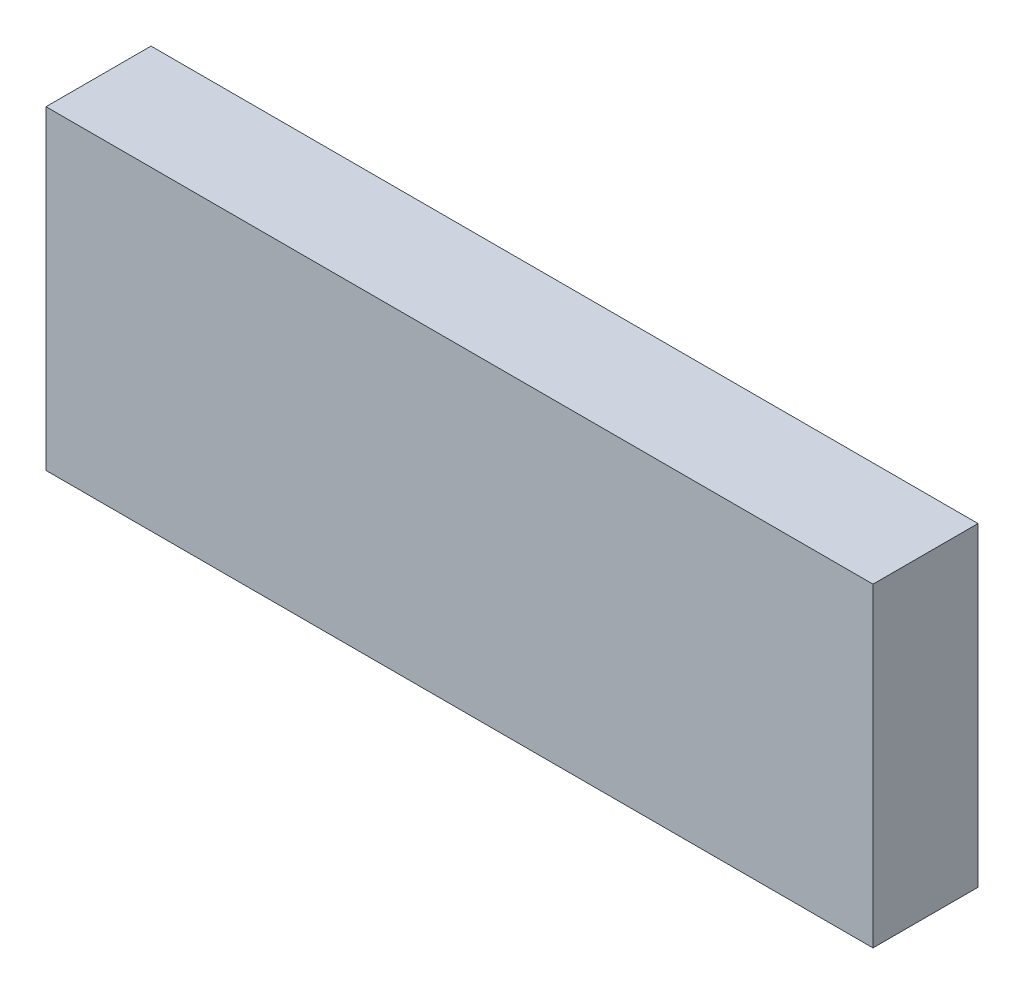
ISO-10303-21;
HEADER;
FILE_DESCRIPTION(('STEP AP214'),'2;1');
FILE_NAME('part.step','',(''),(''),'','','');
FILE_SCHEMA(('AUTOMOTIVE_DESIGN { 1 0 10303 214 1 1 1 1 }'));
ENDSEC;
DATA;
#1=APPLICATION_CONTEXT('core data for automotive mechanical design processes');
#2=APPLICATION_PROTOCOL_DEFINITION('international standard','automotive_design',2000,#1);
#3=PRODUCT_CONTEXT('',#1,'mechanical');
#4=PRODUCT('Part','Part','',(#3));
#5=PRODUCT_RELATED_PRODUCT_CATEGORY('part','',(#4));
#6=PRODUCT_DEFINITION_FORMATION('','',#4);
#7=PRODUCT_DEFINITION_CONTEXT('part definition',#1,'design');
#8=PRODUCT_DEFINITION('design','',#6,#7);
#9=PRODUCT_DEFINITION_SHAPE('','',#8);
#10=(LENGTH_UNIT() NAMED_UNIT(*) SI_UNIT(.MILLI.,.METRE.));
#11=(NAMED_UNIT(*) PLANE_ANGLE_UNIT() SI_UNIT($,.RADIAN.));
#12=(NAMED_UNIT(*) SI_UNIT($,.STERADIAN.) SOLID_ANGLE_UNIT());
#13=UNCERTAINTY_MEASURE_WITH_UNIT(LENGTH_MEASURE(1.E-05),#10,'distance_accuracy_value','');
#14=(GEOMETRIC_REPRESENTATION_CONTEXT(3) GLOBAL_UNCERTAINTY_ASSIGNED_CONTEXT((#13)) GLOBAL_UNIT_ASSIGNED_CONTEXT((#10,
#11,#12)) REPRESENTATION_CONTEXT('',''));
#15=CARTESIAN_POINT('',(0.,0.,0.));
#16=DIRECTION('',(0.,0.,1.));
#17=DIRECTION('',(1.,0.,0.));
#18=AXIS2_PLACEMENT_3D('',#15,#16,#17);
#19=CARTESIAN_POINT('',(157.5,-30.,-10.));
#20=DIRECTION('',(0.,0.,1.));
#21=DIRECTION('',(1.,0.,0.));
#22=AXIS2_PLACEMENT_3D('',#19,#20,#21);
#23=PLANE('',#22);
#24=DIRECTION('',(0.,1.,0.));
#25=VECTOR('',#24,1.);
#26=CARTESIAN_POINT('',(0.,-30.,-10.));
#27=LINE('',#26,#25);
#28=CARTESIAN_POINT('',(0.,-30.,-10.));
#29=VERTEX_POINT('',#28);
#30=CARTESIAN_POINT('',(0.,30.,-10.));
#31=VERTEX_POINT('',#30);
#32=EDGE_CURVE('E100',#29,#31,#27,.T.);
#33=ORIENTED_EDGE('',*,*,#32,.T.);
#34=DIRECTION('',(-1.,0.,0.));
#35=VECTOR('',#34,1.);
#36=CARTESIAN_POINT('',(157.5,30.,-10.));
#37=LINE('',#36,#35);
#38=CARTESIAN_POINT('',(157.5,30.,-10.));
#39=VERTEX_POINT('',#38);
#40=EDGE_CURVE('E11',#39,#31,#37,.T.);
#41=ORIENTED_EDGE('',*,*,#40,.F.);
#42=DIRECTION('',(0.,1.,0.));
#43=VECTOR('',#42,1.);
#44=CARTESIAN_POINT('',(157.5,-30.,-10.));
#45=LINE('',#44,#43);
#46=CARTESIAN_POINT('',(157.5,-30.,-10.));
#47=VERTEX_POINT('',#46);
#48=EDGE_CURVE('E88',#47,#39,#45,.T.);
#49=ORIENTED_EDGE('',*,*,#48,.F.);
#50=DIRECTION('',(-1.,0.,0.));
#51=VECTOR('',#50,1.);
#52=CARTESIAN_POINT('',(157.5,-30.,-10.));
#53=LINE('',#52,#51);
#54=EDGE_CURVE('E96',#47,#29,#53,.T.);
#55=ORIENTED_EDGE('',*,*,#54,.T.);
#56=EDGE_LOOP('',(#33,#41,#49,#55));
#57=FACE_BOUND('',#56,.T.);
#58=ADVANCED_FACE('F37',(#57),#23,.F.);
#59=CARTESIAN_POINT('',(157.5,30.,10.));
#60=DIRECTION('',(0.,-1.,0.));
#61=DIRECTION('',(0.,0.,-1.));
#62=AXIS2_PLACEMENT_3D('',#59,#60,#61);
#63=PLANE('',#62);
#64=DIRECTION('',(0.,0.,1.));
#65=VECTOR('',#64,1.);
#66=CARTESIAN_POINT('',(0.,30.,10.));
#67=LINE('',#66,#65);
#68=CARTESIAN_POINT('',(0.,30.,10.));
#69=VERTEX_POINT('',#68);
#70=EDGE_CURVE('E92',#31,#69,#67,.T.);
#71=ORIENTED_EDGE('',*,*,#70,.T.);
#72=DIRECTION('',(-1.,0.,0.));
#73=VECTOR('',#72,1.);
#74=CARTESIAN_POINT('',(157.5,30.,10.));
#75=LINE('',#74,#73);
#76=CARTESIAN_POINT('',(157.5,30.,10.));
#77=VERTEX_POINT('',#76);
#78=EDGE_CURVE('E45',#77,#69,#75,.T.);
#79=ORIENTED_EDGE('',*,*,#78,.F.);
#80=DIRECTION('',(0.,0.,1.));
#81=VECTOR('',#80,1.);
#82=CARTESIAN_POINT('',(157.5,30.,10.));
#83=LINE('',#82,#81);
#84=EDGE_CURVE('E83',#39,#77,#83,.T.);
#85=ORIENTED_EDGE('',*,*,#84,.F.);
#86=ORIENTED_EDGE('',*,*,#40,.T.);
#87=EDGE_LOOP('',(#71,#79,#85,#86));
#88=FACE_BOUND('',#87,.T.);
#89=ADVANCED_FACE('F91',(#88),#63,.F.);
#90=CARTESIAN_POINT('',(157.5,-30.,10.));
#91=DIRECTION('',(0.,0.,-1.));
#92=DIRECTION('',(-1.,0.,0.));
#93=AXIS2_PLACEMENT_3D('',#90,#91,#92);
#94=PLANE('',#93);
#95=DIRECTION('',(0.,-1.,0.));
#96=VECTOR('',#95,1.);
#97=CARTESIAN_POINT('',(0.,-30.,10.));
#98=LINE('',#97,#96);
#99=CARTESIAN_POINT('',(0.,-30.,10.));
#100=VERTEX_POINT('',#99);
#101=EDGE_CURVE('E70',#69,#100,#98,.T.);
#102=ORIENTED_EDGE('',*,*,#101,.T.);
#103=DIRECTION('',(-1.,0.,0.));
#104=VECTOR('',#103,1.);
#105=CARTESIAN_POINT('',(157.5,-30.,10.));
#106=LINE('',#105,#104);
#107=CARTESIAN_POINT('',(157.5,-30.,10.));
#108=VERTEX_POINT('',#107);
#109=EDGE_CURVE('E93',#108,#100,#106,.T.);
#110=ORIENTED_EDGE('',*,*,#109,.F.);
#111=DIRECTION('',(0.,-1.,0.));
#112=VECTOR('',#111,1.);
#113=CARTESIAN_POINT('',(157.5,-30.,10.));
#114=LINE('',#113,#112);
#115=EDGE_CURVE('E86',#77,#108,#114,.T.);
#116=ORIENTED_EDGE('',*,*,#115,.F.);
#117=ORIENTED_EDGE('',*,*,#78,.T.);
#118=EDGE_LOOP('',(#102,#110,#116,#117));
#119=FACE_BOUND('',#118,.T.);
#120=ADVANCED_FACE('F94',(#119),#94,.F.);
#121=CARTESIAN_POINT('',(157.5,-30.,10.));
#122=DIRECTION('',(0.,1.,0.));
#123=DIRECTION('',(0.,0.,1.));
#124=AXIS2_PLACEMENT_3D('',#121,#122,#123);
#125=PLANE('',#124);
#126=DIRECTION('',(0.,0.,-1.));
#127=VECTOR('',#126,1.);
#128=CARTESIAN_POINT('',(0.,-30.,10.));
#129=LINE('',#128,#127);
#130=EDGE_CURVE('E76',#100,#29,#129,.T.);
#131=ORIENTED_EDGE('',*,*,#130,.T.);
#132=ORIENTED_EDGE('',*,*,#54,.F.);
#133=DIRECTION('',(0.,0.,-1.));
#134=VECTOR('',#133,1.);
#135=CARTESIAN_POINT('',(157.5,-30.,10.));
#136=LINE('',#135,#134);
#137=EDGE_CURVE('E53',#108,#47,#136,.T.);
#138=ORIENTED_EDGE('',*,*,#137,.F.);
#139=ORIENTED_EDGE('',*,*,#109,.T.);
#140=EDGE_LOOP('',(#131,#132,#138,#139));
#141=FACE_BOUND('',#140,.T.);
#142=ADVANCED_FACE('F107',(#141),#125,.F.);
#143=CARTESIAN_POINT('',(157.5,0.,0.));
#144=DIRECTION('',(-1.,0.,0.));
#145=DIRECTION('',(0.,0.,1.));
#146=AXIS2_PLACEMENT_3D('',#143,#144,#145);
#147=PLANE('',#146);
#148=ORIENTED_EDGE('',*,*,#48,.T.);
#149=ORIENTED_EDGE('',*,*,#84,.T.);
#150=ORIENTED_EDGE('',*,*,#115,.T.);
#151=ORIENTED_EDGE('',*,*,#137,.T.);
#152=EDGE_LOOP('',(#148,#149,#150,#151));
#153=FACE_BOUND('',#152,.T.);
#154=ADVANCED_FACE('F84',(#153),#147,.F.);
#155=CARTESIAN_POINT('',(0.,0.,0.));
#156=DIRECTION('',(-1.,0.,0.));
#157=DIRECTION('',(0.,0.,1.));
#158=AXIS2_PLACEMENT_3D('',#155,#156,#157);
#159=PLANE('',#158);
#160=ORIENTED_EDGE('',*,*,#32,.F.);
#161=ORIENTED_EDGE('',*,*,#130,.F.);
#162=ORIENTED_EDGE('',*,*,#101,.F.);
#163=ORIENTED_EDGE('',*,*,#70,.F.);
#164=EDGE_LOOP('',(#160,#161,#162,#163));
#165=FACE_BOUND('',#164,.T.);
#166=ADVANCED_FACE('F110',(#165),#159,.T.);
#167=CLOSED_SHELL('',(#58,#89,#120,#142,#154,#166));
#168=MANIFOLD_SOLID_BREP('B2',#167);
#169=ADVANCED_BREP_SHAPE_REPRESENTATION('',(#18,#168),#14);
#170=SHAPE_DEFINITION_REPRESENTATION(#9,#169);
ENDSEC;
END-ISO-10303-21;
